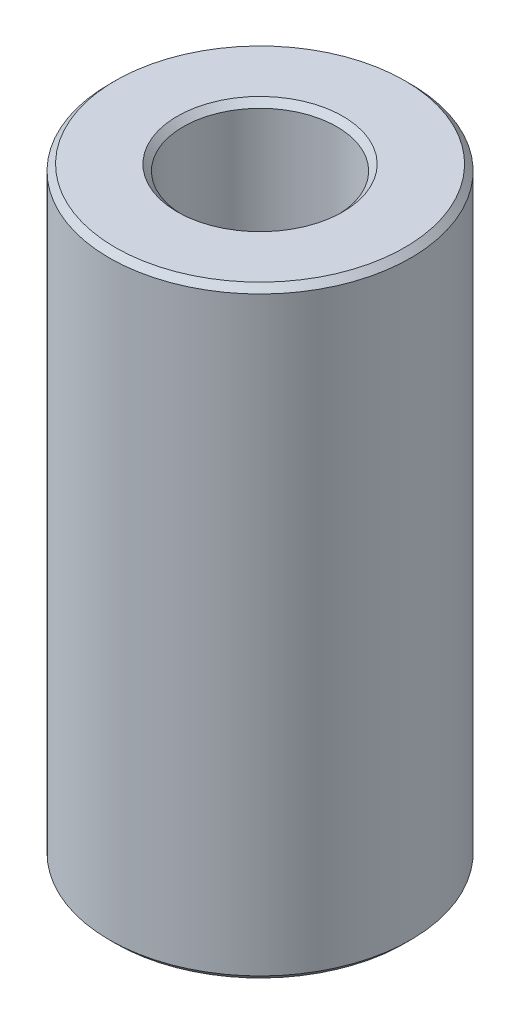
ISO-10303-21;
HEADER;
FILE_DESCRIPTION(('STEP AP214'),'2;1');
FILE_NAME('part.step','',(''),(''),'','','');
FILE_SCHEMA(('AUTOMOTIVE_DESIGN { 1 0 10303 214 1 1 1 1 }'));
ENDSEC;
DATA;
#1=APPLICATION_CONTEXT('core data for automotive mechanical design processes');
#2=APPLICATION_PROTOCOL_DEFINITION('international standard','automotive_design',2000,#1);
#3=PRODUCT_CONTEXT('',#1,'mechanical');
#4=PRODUCT('Part','Part','',(#3));
#5=PRODUCT_RELATED_PRODUCT_CATEGORY('part','',(#4));
#6=PRODUCT_DEFINITION_FORMATION('','',#4);
#7=PRODUCT_DEFINITION_CONTEXT('part definition',#1,'design');
#8=PRODUCT_DEFINITION('design','',#6,#7);
#9=PRODUCT_DEFINITION_SHAPE('','',#8);
#10=(LENGTH_UNIT() NAMED_UNIT(*) SI_UNIT(.MILLI.,.METRE.));
#11=(NAMED_UNIT(*) PLANE_ANGLE_UNIT() SI_UNIT($,.RADIAN.));
#12=(NAMED_UNIT(*) SI_UNIT($,.STERADIAN.) SOLID_ANGLE_UNIT());
#13=UNCERTAINTY_MEASURE_WITH_UNIT(LENGTH_MEASURE(1.E-05),#10,'distance_accuracy_value','');
#14=(GEOMETRIC_REPRESENTATION_CONTEXT(3) GLOBAL_UNCERTAINTY_ASSIGNED_CONTEXT((#13)) GLOBAL_UNIT_ASSIGNED_CONTEXT((#10,
#11,#12)) REPRESENTATION_CONTEXT('',''));
#15=CARTESIAN_POINT('',(0.,0.,0.));
#16=DIRECTION('',(0.,0.,1.));
#17=DIRECTION('',(1.,0.,0.));
#18=AXIS2_PLACEMENT_3D('',#15,#16,#17);
#19=CARTESIAN_POINT('',(0.,10.,-2.75));
#20=DIRECTION('',(0.,-1.,0.));
#21=DIRECTION('',(0.,0.,-1.));
#22=AXIS2_PLACEMENT_3D('',#19,#20,#21);
#23=PLANE('',#22);
#24=CARTESIAN_POINT('',(0.,10.,0.));
#25=DIRECTION('',(0.,1.,0.));
#26=DIRECTION('',(0.,0.,1.));
#27=AXIS2_PLACEMENT_3D('',#24,#25,#26);
#28=CIRCLE('',#27,2.75);
#29=CARTESIAN_POINT('',(0.,10.,2.75));
#30=VERTEX_POINT('',#29);
#31=EDGE_CURVE('E65',#30,#30,#28,.T.);
#32=ORIENTED_EDGE('',*,*,#31,.F.);
#33=EDGE_LOOP('',(#32));
#34=FACE_BOUND('',#33,.T.);
#35=CARTESIAN_POINT('',(0.,10.,0.));
#36=DIRECTION('',(0.,1.,0.));
#37=DIRECTION('',(0.,0.,1.));
#38=AXIS2_PLACEMENT_3D('',#35,#36,#37);
#39=CIRCLE('',#38,4.8);
#40=CARTESIAN_POINT('',(0.,10.,4.8));
#41=VERTEX_POINT('',#40);
#42=EDGE_CURVE('E10',#41,#41,#39,.T.);
#43=ORIENTED_EDGE('',*,*,#42,.T.);
#44=EDGE_LOOP('',(#43));
#45=FACE_BOUND('',#44,.T.);
#46=ADVANCED_FACE('F37',(#34,#45),#23,.F.);
#47=CARTESIAN_POINT('',(0.,9.8,0.));
#48=DIRECTION('',(0.,-1.,0.));
#49=DIRECTION('',(0.,0.,-1.));
#50=AXIS2_PLACEMENT_3D('',#47,#48,#49);
#51=CONICAL_SURFACE('',#50,5.,0.785398163397435);
#52=ORIENTED_EDGE('',*,*,#42,.F.);
#53=EDGE_LOOP('',(#52));
#54=FACE_BOUND('',#53,.T.);
#55=CARTESIAN_POINT('',(0.,9.8,0.));
#56=DIRECTION('',(0.,1.,0.));
#57=DIRECTION('',(0.,0.,1.));
#58=AXIS2_PLACEMENT_3D('',#55,#56,#57);
#59=CIRCLE('',#58,5.);
#60=CARTESIAN_POINT('',(0.,9.8,5.));
#61=VERTEX_POINT('',#60);
#62=EDGE_CURVE('E43',#61,#61,#59,.T.);
#63=ORIENTED_EDGE('',*,*,#62,.T.);
#64=EDGE_LOOP('',(#63));
#65=FACE_BOUND('',#64,.T.);
#66=ADVANCED_FACE('F72',(#54,#65),#51,.T.);
#67=CARTESIAN_POINT('',(0.,2.13387096774193,0.));
#68=DIRECTION('',(0.,1.,0.));
#69=DIRECTION('',(0.,0.,1.));
#70=AXIS2_PLACEMENT_3D('',#67,#68,#69);
#71=CYLINDRICAL_SURFACE('',#70,5.);
#72=ORIENTED_EDGE('',*,*,#62,.F.);
#73=EDGE_LOOP('',(#72));
#74=FACE_BOUND('',#73,.T.);
#75=CARTESIAN_POINT('',(0.,-9.8,0.));
#76=DIRECTION('',(0.,1.,0.));
#77=DIRECTION('',(0.,0.,1.));
#78=AXIS2_PLACEMENT_3D('',#75,#76,#77);
#79=CIRCLE('',#78,5.);
#80=CARTESIAN_POINT('',(0.,-9.8,5.));
#81=VERTEX_POINT('',#80);
#82=EDGE_CURVE('E47',#81,#81,#79,.T.);
#83=ORIENTED_EDGE('',*,*,#82,.T.);
#84=EDGE_LOOP('',(#83));
#85=FACE_BOUND('',#84,.T.);
#86=ADVANCED_FACE('F76',(#74,#85),#71,.T.);
#87=CARTESIAN_POINT('',(0.,-10.,0.));
#88=DIRECTION('',(0.,1.,0.));
#89=DIRECTION('',(0.,0.,1.));
#90=AXIS2_PLACEMENT_3D('',#87,#88,#89);
#91=CONICAL_SURFACE('',#90,4.8,0.78539816339745);
#92=ORIENTED_EDGE('',*,*,#82,.F.);
#93=EDGE_LOOP('',(#92));
#94=FACE_BOUND('',#93,.T.);
#95=CARTESIAN_POINT('',(0.,-10.,0.));
#96=DIRECTION('',(0.,1.,0.));
#97=DIRECTION('',(0.,0.,1.));
#98=AXIS2_PLACEMENT_3D('',#95,#96,#97);
#99=CIRCLE('',#98,4.8);
#100=CARTESIAN_POINT('',(0.,-10.,4.8));
#101=VERTEX_POINT('',#100);
#102=EDGE_CURVE('E51',#101,#101,#99,.T.);
#103=ORIENTED_EDGE('',*,*,#102,.T.);
#104=EDGE_LOOP('',(#103));
#105=FACE_BOUND('',#104,.T.);
#106=ADVANCED_FACE('F81',(#94,#105),#91,.T.);
#107=CARTESIAN_POINT('',(0.,-10.,-2.75));
#108=DIRECTION('',(0.,1.,0.));
#109=DIRECTION('',(0.,0.,1.));
#110=AXIS2_PLACEMENT_3D('',#107,#108,#109);
#111=PLANE('',#110);
#112=ORIENTED_EDGE('',*,*,#102,.F.);
#113=EDGE_LOOP('',(#112));
#114=FACE_BOUND('',#113,.T.);
#115=CARTESIAN_POINT('',(0.,-10.,0.));
#116=DIRECTION('',(0.,1.,0.));
#117=DIRECTION('',(0.,0.,1.));
#118=AXIS2_PLACEMENT_3D('',#115,#116,#117);
#119=CIRCLE('',#118,2.75);
#120=CARTESIAN_POINT('',(0.,-10.,2.75));
#121=VERTEX_POINT('',#120);
#122=EDGE_CURVE('E56',#121,#121,#119,.T.);
#123=ORIENTED_EDGE('',*,*,#122,.T.);
#124=EDGE_LOOP('',(#123));
#125=FACE_BOUND('',#124,.T.);
#126=ADVANCED_FACE('F87',(#114,#125),#111,.F.);
#127=CARTESIAN_POINT('',(0.,-9.8,0.));
#128=DIRECTION('',(0.,-1.,0.));
#129=DIRECTION('',(0.,0.,-1.));
#130=AXIS2_PLACEMENT_3D('',#127,#128,#129);
#131=CONICAL_SURFACE('',#130,2.55,0.785398163397446);
#132=ORIENTED_EDGE('',*,*,#122,.F.);
#133=EDGE_LOOP('',(#132));
#134=FACE_BOUND('',#133,.T.);
#135=CARTESIAN_POINT('',(0.,-9.8,0.));
#136=DIRECTION('',(0.,1.,0.));
#137=DIRECTION('',(0.,0.,1.));
#138=AXIS2_PLACEMENT_3D('',#135,#136,#137);
#139=CIRCLE('',#138,2.55);
#140=CARTESIAN_POINT('',(0.,-9.8,2.55));
#141=VERTEX_POINT('',#140);
#142=EDGE_CURVE('E59',#141,#141,#139,.T.);
#143=ORIENTED_EDGE('',*,*,#142,.T.);
#144=EDGE_LOOP('',(#143));
#145=FACE_BOUND('',#144,.T.);
#146=ADVANCED_FACE('F91',(#134,#145),#131,.F.);
#147=CARTESIAN_POINT('',(0.,2.13387096774193,0.));
#148=DIRECTION('',(0.,1.,0.));
#149=DIRECTION('',(0.,0.,1.));
#150=AXIS2_PLACEMENT_3D('',#147,#148,#149);
#151=CYLINDRICAL_SURFACE('',#150,2.55);
#152=ORIENTED_EDGE('',*,*,#142,.F.);
#153=EDGE_LOOP('',(#152));
#154=FACE_BOUND('',#153,.T.);
#155=CARTESIAN_POINT('',(0.,9.8,0.));
#156=DIRECTION('',(0.,1.,0.));
#157=DIRECTION('',(0.,0.,1.));
#158=AXIS2_PLACEMENT_3D('',#155,#156,#157);
#159=CIRCLE('',#158,2.55);
#160=CARTESIAN_POINT('',(0.,9.8,2.55));
#161=VERTEX_POINT('',#160);
#162=EDGE_CURVE('E62',#161,#161,#159,.T.);
#163=ORIENTED_EDGE('',*,*,#162,.T.);
#164=EDGE_LOOP('',(#163));
#165=FACE_BOUND('',#164,.T.);
#166=ADVANCED_FACE('F95',(#154,#165),#151,.F.);
#167=CARTESIAN_POINT('',(0.,10.,0.));
#168=DIRECTION('',(0.,1.,0.));
#169=DIRECTION('',(0.,0.,1.));
#170=AXIS2_PLACEMENT_3D('',#167,#168,#169);
#171=CONICAL_SURFACE('',#170,2.75,0.785398163397448);
#172=ORIENTED_EDGE('',*,*,#162,.F.);
#173=EDGE_LOOP('',(#172));
#174=FACE_BOUND('',#173,.T.);
#175=ORIENTED_EDGE('',*,*,#31,.T.);
#176=EDGE_LOOP('',(#175));
#177=FACE_BOUND('',#176,.T.);
#178=ADVANCED_FACE('F69',(#174,#177),#171,.F.);
#179=CLOSED_SHELL('',(#46,#66,#86,#106,#126,#146,#166,#178));
#180=MANIFOLD_SOLID_BREP('B2',#179);
#181=ADVANCED_BREP_SHAPE_REPRESENTATION('',(#18,#180),#14);
#182=SHAPE_DEFINITION_REPRESENTATION(#9,#181);
ENDSEC;
END-ISO-10303-21;
